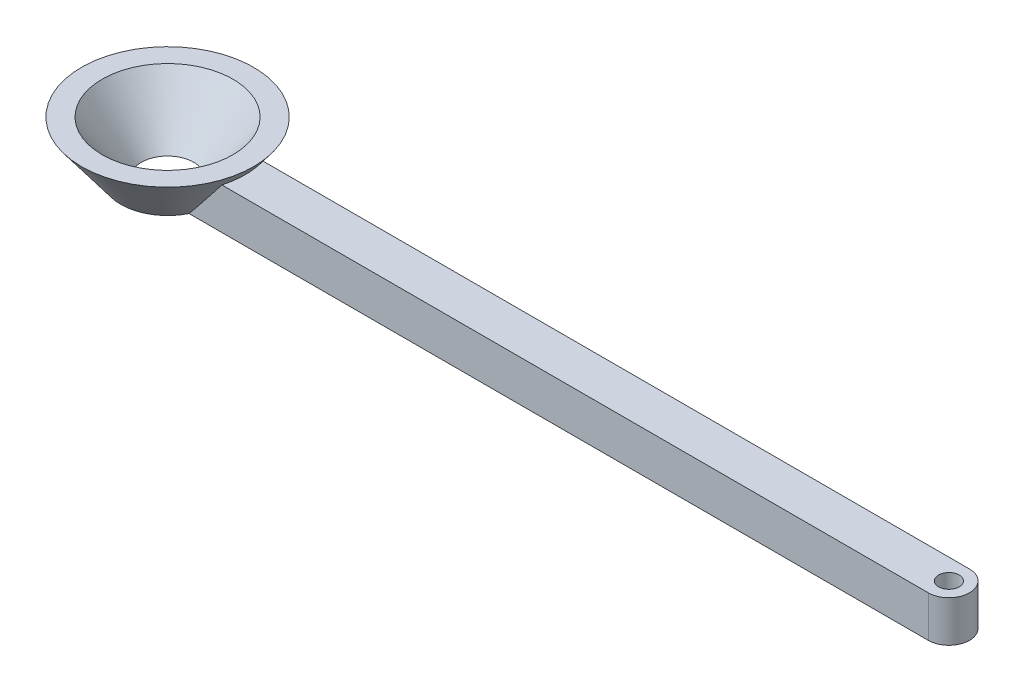
ISO-10303-21;
HEADER;
FILE_DESCRIPTION(('STEP AP214'),'2;1');
FILE_NAME('part.step','',(''),(''),'','','');
FILE_SCHEMA(('AUTOMOTIVE_DESIGN { 1 0 10303 214 1 1 1 1 }'));
ENDSEC;
DATA;
#1=APPLICATION_CONTEXT('core data for automotive mechanical design processes');
#2=APPLICATION_PROTOCOL_DEFINITION('international standard','automotive_design',2000,#1);
#3=PRODUCT_CONTEXT('',#1,'mechanical');
#4=PRODUCT('Part','Part','',(#3));
#5=PRODUCT_RELATED_PRODUCT_CATEGORY('part','',(#4));
#6=PRODUCT_DEFINITION_FORMATION('','',#4);
#7=PRODUCT_DEFINITION_CONTEXT('part definition',#1,'design');
#8=PRODUCT_DEFINITION('design','',#6,#7);
#9=PRODUCT_DEFINITION_SHAPE('','',#8);
#10=(LENGTH_UNIT() NAMED_UNIT(*) SI_UNIT(.MILLI.,.METRE.));
#11=(NAMED_UNIT(*) PLANE_ANGLE_UNIT() SI_UNIT($,.RADIAN.));
#12=(NAMED_UNIT(*) SI_UNIT($,.STERADIAN.) SOLID_ANGLE_UNIT());
#13=UNCERTAINTY_MEASURE_WITH_UNIT(LENGTH_MEASURE(1.E-05),#10,'distance_accuracy_value','');
#14=(GEOMETRIC_REPRESENTATION_CONTEXT(3) GLOBAL_UNCERTAINTY_ASSIGNED_CONTEXT((#13)) GLOBAL_UNIT_ASSIGNED_CONTEXT((#10,
#11,#12)) REPRESENTATION_CONTEXT('',''));
#15=CARTESIAN_POINT('',(0.,0.,0.));
#16=DIRECTION('',(0.,0.,1.));
#17=DIRECTION('',(1.,0.,0.));
#18=AXIS2_PLACEMENT_3D('',#15,#16,#17);
#19=CARTESIAN_POINT('',(0.,10.,-5.));
#20=DIRECTION('',(0.,0.,1.));
#21=DIRECTION('',(1.,0.,0.));
#22=AXIS2_PLACEMENT_3D('',#19,#20,#21);
#23=PLANE('',#22);
#24=CARTESIAN_POINT('',(-62.0302873694782,35.3021651924808,-4.99999999999999));
#25=CARTESIAN_POINT('',(-63.1108720704721,33.8740806067122,-4.99999999999999));
#26=CARTESIAN_POINT('',(-64.1919277877077,32.446351819369,-4.99999999999999));
#27=CARTESIAN_POINT('',(-66.3554224879902,29.591915959772,-4.99999999999999));
#28=CARTESIAN_POINT('',(-67.4378614873972,28.1652088999196,-4.99999999999999));
#29=CARTESIAN_POINT('',(-69.6049899793198,25.3125660458291,-4.99999999999999));
#30=CARTESIAN_POINT('',(-70.689680222095,23.8866308213389,-4.99999999999999));
#31=CARTESIAN_POINT('',(-72.861557258893,21.0366857826083,-4.99999999999999));
#32=CARTESIAN_POINT('',(-73.9487440270011,19.6126759486236,-4.99999999999999));
#33=CARTESIAN_POINT('',(-76.1366785324103,16.7543803279052,-4.99999999999999));
#34=CARTESIAN_POINT('',(-77.2374593053861,15.3201198006345,-4.99999999999999));
#35=CARTESIAN_POINT('',(-78.8928677056523,13.171956183486,-4.99999999999999));
#36=CARTESIAN_POINT('',(-79.445385824924,12.4564277774987,-4.99999999999999));
#37=CARTESIAN_POINT('',(-80.5522230214364,11.0267666172281,-4.99999999999999));
#38=CARTESIAN_POINT('',(-81.1065420956054,10.3126338605673,-4.99999999999999));
#39=CARTESIAN_POINT('',(-82.2173923671904,8.88631956553523,-4.99999999999999));
#40=CARTESIAN_POINT('',(-82.7739230990276,8.17413766481403,-4.99999999999999));
#41=CARTESIAN_POINT('',(-83.8900630153775,6.75219208553308,-4.99999999999999));
#42=CARTESIAN_POINT('',(-84.4496721913153,6.04242840024649,-4.99999999999999));
#43=CARTESIAN_POINT('',(-85.5730514151877,4.6262528714617,-4.99999999999999));
#44=CARTESIAN_POINT('',(-86.1368212512335,3.91984086024302,-4.99999999999999));
#45=CARTESIAN_POINT('',(-86.9869405383949,2.86382443243642,-4.99999999999999));
#46=CARTESIAN_POINT('',(-87.2710558168831,2.51242154847554,-4.99999999999999));
#47=CARTESIAN_POINT('',(-87.8411015414336,1.81109177444719,-4.99999999999999));
#48=CARTESIAN_POINT('',(-88.1270319801504,1.46116487841622,-4.99999999999999));
#49=CARTESIAN_POINT('',(-88.5535217116424,0.942601726981684,-4.99999999999999));
#50=CARTESIAN_POINT('',(-88.6932310449964,0.773266259529523,-4.99999999999999));
#51=CARTESIAN_POINT('',(-88.9732357404597,0.435079886058965,-4.99999999999999));
#52=CARTESIAN_POINT('',(-89.1135311040736,0.266228981286462,-4.99999999999999));
#53=CARTESIAN_POINT('',(-89.5353931244185,-0.239513529313089,-4.99999999999999));
#54=CARTESIAN_POINT('',(-89.8179347024525,-0.575593703650734,-4.99999999999999));
#55=CARTESIAN_POINT('',(-90.3860583503282,-1.24472649661884,-4.99999999999999));
#56=CARTESIAN_POINT('',(-90.6716378780207,-1.57778127131325,-4.99999999999999));
#57=CARTESIAN_POINT('',(-91.246965552302,-2.24028540178618,-4.99999999999999));
#58=CARTESIAN_POINT('',(-91.5367137215942,-2.56973473791138,-4.99999999999999));
#59=CARTESIAN_POINT('',(-92.0233203069065,-3.11378944782606,-4.99999999999999));
#60=CARTESIAN_POINT('',(-92.2186508731109,-3.32976020983891,-4.99999999999999));
#61=CARTESIAN_POINT('',(-92.6122288415135,-3.75900964179536,-4.99999999999999));
#62=CARTESIAN_POINT('',(-92.8104760801282,-3.97228846148121,-4.99999999999999));
#63=CARTESIAN_POINT('',(-93.2106884583959,-4.39559879938018,-4.99999999999999));
#64=CARTESIAN_POINT('',(-93.4126558816584,-4.6056281668364,-4.99999999999999));
#65=CARTESIAN_POINT('',(-93.7189788389496,-4.9173944350338,-4.99999999999999));
#66=CARTESIAN_POINT('',(-93.8216576777768,-5.02077921190277,-4.99999999999999));
#67=CARTESIAN_POINT('',(-94.0282824296164,-5.22628188208933,-4.99999999999999));
#68=CARTESIAN_POINT('',(-94.1322283900686,-5.32839972768361,-4.99999999999999));
#69=CARTESIAN_POINT('',(-94.2368784387653,-5.42979632446492,-4.99999999999999));
#70=B_SPLINE_CURVE_WITH_KNOTS('',3,(#24,#25,#26,#27,#28,#29,#30,#31,#32,#33,#34,#35,#36,#37,#38,
#39,#40,#41,#42,#43,#44,#45,#46,#47,#48,#49,#50,#51,#52,#53,#54,#55,#56,#57,#58,#59,#60,#61,#62,
#63,#64,#65,#66,#67,#68,#69),.UNSPECIFIED.,.F.,.F.,(4,2,2,2,2,2,2,2,2,2,2,2,2,2,2,2,2,2,2,2,2,2,
4),(0.,5.37250467592529,10.7450734922,16.1198827828554,21.4946365315513,26.9185906436164,
29.6306568166589,32.3427183661502,35.0542364098093,37.7657469045783,40.4771202510318,
41.8327888762761,43.1884520188912,43.8470393215209,44.5056283159787,45.8228110708124,
47.1389669273305,48.4551299546749,49.3287083276684,50.2022378908215,51.0763228208418,
51.5134424925067,51.950578580093),.UNSPECIFIED.);
#71=CARTESIAN_POINT('',(-81.350223522695,10.,-4.99999999999999));
#72=VERTEX_POINT('',#71);
#73=CARTESIAN_POINT('',(-89.3356673427549,0.,-4.99999999999999));
#74=VERTEX_POINT('',#73);
#75=EDGE_CURVE('E97',#72,#74,#70,.T.);
#76=ORIENTED_EDGE('',*,*,#75,.F.);
#77=DIRECTION('',(-1.,0.,0.));
#78=VECTOR('',#77,1.);
#79=CARTESIAN_POINT('',(0.,10.,-5.));
#80=LINE('',#79,#78);
#81=CARTESIAN_POINT('',(90.,10.,-5.00000000000001));
#82=VERTEX_POINT('',#81);
#83=EDGE_CURVE('E99',#82,#72,#80,.T.);
#84=ORIENTED_EDGE('',*,*,#83,.F.);
#85=DIRECTION('',(0.,-1.,0.));
#86=VECTOR('',#85,1.);
#87=CARTESIAN_POINT('',(90.,10.,-5.00000000000001));
#88=LINE('',#87,#86);
#89=CARTESIAN_POINT('',(90.,0.,-5.00000000000001));
#90=VERTEX_POINT('',#89);
#91=EDGE_CURVE('E11',#82,#90,#88,.T.);
#92=ORIENTED_EDGE('',*,*,#91,.T.);
#93=DIRECTION('',(-1.,0.,0.));
#94=VECTOR('',#93,1.);
#95=CARTESIAN_POINT('',(0.,0.,-5.));
#96=LINE('',#95,#94);
#97=EDGE_CURVE('E85',#90,#74,#96,.T.);
#98=ORIENTED_EDGE('',*,*,#97,.T.);
#99=EDGE_LOOP('',(#76,#84,#92,#98));
#100=FACE_BOUND('',#99,.T.);
#101=ADVANCED_FACE('F35',(#100),#23,.F.);
#102=CARTESIAN_POINT('',(0.,10.,5.));
#103=DIRECTION('',(0.,0.,1.));
#104=DIRECTION('',(1.,0.,0.));
#105=AXIS2_PLACEMENT_3D('',#102,#103,#104);
#106=PLANE('',#105);
#107=DIRECTION('',(-1.,0.,0.));
#108=VECTOR('',#107,1.);
#109=CARTESIAN_POINT('',(0.,10.,5.));
#110=LINE('',#109,#108);
#111=CARTESIAN_POINT('',(90.,10.,4.99999999999999));
#112=VERTEX_POINT('',#111);
#113=CARTESIAN_POINT('',(-81.350223522695,10.,5.00000000000001));
#114=VERTEX_POINT('',#113);
#115=EDGE_CURVE('E75',#112,#114,#110,.T.);
#116=ORIENTED_EDGE('',*,*,#115,.T.);
#117=CARTESIAN_POINT('',(-62.0302873694782,35.3021651924808,5.00000000000001));
#118=CARTESIAN_POINT('',(-63.1108720704721,33.8740806067122,5.00000000000001));
#119=CARTESIAN_POINT('',(-64.1919277877077,32.446351819369,5.00000000000001));
#120=CARTESIAN_POINT('',(-66.3554224879902,29.591915959772,5.00000000000001));
#121=CARTESIAN_POINT('',(-67.4378614873972,28.1652088999196,5.00000000000001));
#122=CARTESIAN_POINT('',(-69.6049899793198,25.3125660458291,5.00000000000001));
#123=CARTESIAN_POINT('',(-70.689680222095,23.8866308213389,5.00000000000001));
#124=CARTESIAN_POINT('',(-72.861557258893,21.0366857826083,5.00000000000001));
#125=CARTESIAN_POINT('',(-73.9487440270011,19.6126759486236,5.00000000000001));
#126=CARTESIAN_POINT('',(-76.1366785324103,16.7543803279052,5.00000000000001));
#127=CARTESIAN_POINT('',(-77.2374593053861,15.3201198006345,5.00000000000001));
#128=CARTESIAN_POINT('',(-78.8928677056523,13.171956183486,5.00000000000001));
#129=CARTESIAN_POINT('',(-79.445385824924,12.4564277774988,5.00000000000001));
#130=CARTESIAN_POINT('',(-80.5522230214364,11.0267666172281,5.00000000000001));
#131=CARTESIAN_POINT('',(-81.1065420956054,10.3126338605673,5.00000000000001));
#132=CARTESIAN_POINT('',(-82.2173923671904,8.88631956553523,5.00000000000001));
#133=CARTESIAN_POINT('',(-82.7739230990276,8.17413766481403,5.00000000000001));
#134=CARTESIAN_POINT('',(-83.8900630153774,6.75219208553309,5.00000000000001));
#135=CARTESIAN_POINT('',(-84.4496721913153,6.04242840024651,5.00000000000001));
#136=CARTESIAN_POINT('',(-85.5730514151877,4.62625287146172,5.00000000000001));
#137=CARTESIAN_POINT('',(-86.1368212512335,3.91984086024303,5.00000000000001));
#138=CARTESIAN_POINT('',(-86.9869405383949,2.86382443243643,5.00000000000001));
#139=CARTESIAN_POINT('',(-87.271055816883,2.51242154847555,5.00000000000001));
#140=CARTESIAN_POINT('',(-87.8411015414335,1.81109177444721,5.00000000000001));
#141=CARTESIAN_POINT('',(-88.1270319801503,1.46116487841624,5.00000000000001));
#142=CARTESIAN_POINT('',(-88.5535217116424,0.942601726981712,5.00000000000001));
#143=CARTESIAN_POINT('',(-88.6932310449964,0.773266259529552,5.00000000000001));
#144=CARTESIAN_POINT('',(-88.9732357404597,0.435079886058995,5.00000000000001));
#145=CARTESIAN_POINT('',(-89.1135311040736,0.266228981286493,5.00000000000001));
#146=CARTESIAN_POINT('',(-89.5353931244185,-0.239513529313058,5.00000000000001));
#147=CARTESIAN_POINT('',(-89.8179347024525,-0.575593703650703,5.00000000000001));
#148=CARTESIAN_POINT('',(-90.3860583503282,-1.24472649661882,5.00000000000001));
#149=CARTESIAN_POINT('',(-90.6716378780207,-1.57778127131323,5.00000000000001));
#150=CARTESIAN_POINT('',(-91.246965552302,-2.24028540178616,5.00000000000001));
#151=CARTESIAN_POINT('',(-91.5367137215942,-2.56973473791135,5.00000000000001));
#152=CARTESIAN_POINT('',(-92.0233203069065,-3.11378944782602,5.00000000000001));
#153=CARTESIAN_POINT('',(-92.2186508731109,-3.32976020983889,5.00000000000001));
#154=CARTESIAN_POINT('',(-92.6122288415135,-3.75900964179533,5.00000000000001));
#155=CARTESIAN_POINT('',(-92.8104760801282,-3.97228846148118,5.00000000000001));
#156=CARTESIAN_POINT('',(-93.2106884583959,-4.39559879938014,5.00000000000001));
#157=CARTESIAN_POINT('',(-93.4126558816584,-4.60562816683638,5.00000000000001));
#158=CARTESIAN_POINT('',(-93.7189788389496,-4.91739443503377,5.00000000000001));
#159=CARTESIAN_POINT('',(-93.8216576777768,-5.02077921190273,5.00000000000001));
#160=CARTESIAN_POINT('',(-94.0282824296164,-5.22628188208929,5.00000000000001));
#161=CARTESIAN_POINT('',(-94.1322283900686,-5.32839972768358,5.00000000000001));
#162=CARTESIAN_POINT('',(-94.2368784387653,-5.42979632446489,5.00000000000001));
#163=B_SPLINE_CURVE_WITH_KNOTS('',3,(#117,#118,#119,#120,#121,#122,#123,#124,#125,#126,#127,
#128,#129,#130,#131,#132,#133,#134,#135,#136,#137,#138,#139,#140,#141,#142,#143,#144,#145,#146,
#147,#148,#149,#150,#151,#152,#153,#154,#155,#156,#157,#158,#159,#160,#161,#162),.UNSPECIFIED.,
.F.,.F.,(4,2,2,2,2,2,2,2,2,2,2,2,2,2,2,2,2,2,2,2,2,2,4),(0.,5.37250467592528,10.7450734922,
16.1198827828554,21.4946365315514,26.9185906436164,29.630656816659,32.3427183661503,
35.0542364098093,37.7657469045783,40.4771202510318,41.8327888762761,43.1884520188912,
43.8470393215209,44.5056283159787,45.8228110708124,47.1389669273305,48.4551299546748,
49.3287083276684,50.2022378908215,51.0763228208418,51.5134424925067,51.950578580093),.UNSPECIFIED.);
#164=CARTESIAN_POINT('',(-89.3356673427549,0.,5.00000000000002));
#165=VERTEX_POINT('',#164);
#166=EDGE_CURVE('E50',#114,#165,#163,.T.);
#167=ORIENTED_EDGE('',*,*,#166,.T.);
#168=DIRECTION('',(-1.,0.,0.));
#169=VECTOR('',#168,1.);
#170=CARTESIAN_POINT('',(0.,0.,5.));
#171=LINE('',#170,#169);
#172=CARTESIAN_POINT('',(90.,0.,4.99999999999999));
#173=VERTEX_POINT('',#172);
#174=EDGE_CURVE('E83',#173,#165,#171,.T.);
#175=ORIENTED_EDGE('',*,*,#174,.F.);
#176=DIRECTION('',(0.,-1.,0.));
#177=VECTOR('',#176,1.);
#178=CARTESIAN_POINT('',(90.,10.,4.99999999999999));
#179=LINE('',#178,#177);
#180=EDGE_CURVE('E43',#112,#173,#179,.T.);
#181=ORIENTED_EDGE('',*,*,#180,.F.);
#182=EDGE_LOOP('',(#116,#167,#175,#181));
#183=FACE_BOUND('',#182,.T.);
#184=ADVANCED_FACE('F88',(#183),#106,.T.);
#185=CARTESIAN_POINT('',(0.,10.,0.));
#186=DIRECTION('',(0.,1.,0.));
#187=DIRECTION('',(0.,0.,1.));
#188=AXIS2_PLACEMENT_3D('',#185,#186,#187);
#189=PLANE('',#188);
#190=CARTESIAN_POINT('',(89.9999999999996,10.,0.));
#191=DIRECTION('',(0.,1.,0.));
#192=DIRECTION('',(0.,0.,1.));
#193=AXIS2_PLACEMENT_3D('',#190,#191,#192);
#194=CIRCLE('',#193,2.50000000000001);
#195=CARTESIAN_POINT('',(89.9999999999996,10.,2.5));
#196=VERTEX_POINT('',#195);
#197=EDGE_CURVE('E89',#196,#196,#194,.T.);
#198=ORIENTED_EDGE('',*,*,#197,.F.);
#199=EDGE_LOOP('',(#198));
#200=FACE_BOUND('',#199,.T.);
#201=ORIENTED_EDGE('',*,*,#83,.T.);
#202=CARTESIAN_POINT('',(-99.525,10.,0.));
#203=DIRECTION('',(0.,1.,0.));
#204=DIRECTION('',(0.,0.,1.));
#205=AXIS2_PLACEMENT_3D('',#202,#203,#204);
#206=CIRCLE('',#205,18.85);
#207=EDGE_CURVE('E143',#72,#114,#206,.F.);
#208=ORIENTED_EDGE('',*,*,#207,.T.);
#209=ORIENTED_EDGE('',*,*,#115,.F.);
#210=CARTESIAN_POINT('',(89.9999999999996,10.,0.));
#211=DIRECTION('',(0.,1.,0.));
#212=DIRECTION('',(0.,0.,1.));
#213=AXIS2_PLACEMENT_3D('',#210,#211,#212);
#214=CIRCLE('',#213,5.);
#215=EDGE_CURVE('E73',#82,#112,#214,.F.);
#216=ORIENTED_EDGE('',*,*,#215,.F.);
#217=EDGE_LOOP('',(#201,#208,#209,#216));
#218=FACE_BOUND('',#217,.T.);
#219=ADVANCED_FACE('F125',(#200,#218),#189,.T.);
#220=CARTESIAN_POINT('',(89.9999999999996,10.,0.));
#221=DIRECTION('',(0.,-1.,0.));
#222=DIRECTION('',(0.,0.,-1.));
#223=AXIS2_PLACEMENT_3D('',#220,#221,#222);
#224=CYLINDRICAL_SURFACE('',#223,5.);
#225=CARTESIAN_POINT('',(89.9999999999996,0.,0.));
#226=DIRECTION('',(0.,1.,0.));
#227=DIRECTION('',(0.,0.,1.));
#228=AXIS2_PLACEMENT_3D('',#225,#226,#227);
#229=CIRCLE('',#228,5.);
#230=EDGE_CURVE('E71',#90,#173,#229,.F.);
#231=ORIENTED_EDGE('',*,*,#230,.F.);
#232=ORIENTED_EDGE('',*,*,#91,.F.);
#233=ORIENTED_EDGE('',*,*,#215,.T.);
#234=ORIENTED_EDGE('',*,*,#180,.T.);
#235=EDGE_LOOP('',(#231,#232,#233,#234));
#236=FACE_BOUND('',#235,.T.);
#237=ADVANCED_FACE('F70',(#236),#224,.T.);
#238=CARTESIAN_POINT('',(89.9999999999996,10.,0.));
#239=DIRECTION('',(0.,-1.,0.));
#240=DIRECTION('',(0.,0.,-1.));
#241=AXIS2_PLACEMENT_3D('',#238,#239,#240);
#242=CYLINDRICAL_SURFACE('',#241,2.50000000000001);
#243=ORIENTED_EDGE('',*,*,#197,.T.);
#244=EDGE_LOOP('',(#243));
#245=FACE_BOUND('',#244,.T.);
#246=CARTESIAN_POINT('',(89.9999999999996,0.,0.));
#247=DIRECTION('',(0.,1.,0.));
#248=DIRECTION('',(0.,0.,1.));
#249=AXIS2_PLACEMENT_3D('',#246,#247,#248);
#250=CIRCLE('',#249,2.50000000000001);
#251=CARTESIAN_POINT('',(89.9999999999996,0.,2.5));
#252=VERTEX_POINT('',#251);
#253=EDGE_CURVE('E86',#252,#252,#250,.T.);
#254=ORIENTED_EDGE('',*,*,#253,.F.);
#255=EDGE_LOOP('',(#254));
#256=FACE_BOUND('',#255,.T.);
#257=ADVANCED_FACE('F37',(#245,#256),#242,.F.);
#258=CARTESIAN_POINT('',(0.,0.,0.));
#259=DIRECTION('',(0.,1.,0.));
#260=DIRECTION('',(0.,0.,1.));
#261=AXIS2_PLACEMENT_3D('',#258,#259,#260);
#262=PLANE('',#261);
#263=CARTESIAN_POINT('',(-99.525,0.,0.));
#264=DIRECTION('',(0.,1.,0.));
#265=DIRECTION('',(0.,0.,1.));
#266=AXIS2_PLACEMENT_3D('',#263,#264,#265);
#267=CIRCLE('',#266,11.35);
#268=EDGE_CURVE('E144',#74,#165,#267,.T.);
#269=ORIENTED_EDGE('',*,*,#268,.F.);
#270=ORIENTED_EDGE('',*,*,#97,.F.);
#271=ORIENTED_EDGE('',*,*,#230,.T.);
#272=ORIENTED_EDGE('',*,*,#174,.T.);
#273=EDGE_LOOP('',(#269,#270,#271,#272));
#274=FACE_BOUND('',#273,.T.);
#275=ORIENTED_EDGE('',*,*,#253,.T.);
#276=EDGE_LOOP('',(#275));
#277=FACE_BOUND('',#276,.T.);
#278=CARTESIAN_POINT('',(-99.525,0.,0.));
#279=DIRECTION('',(0.,1.,0.));
#280=DIRECTION('',(0.,0.,1.));
#281=AXIS2_PLACEMENT_3D('',#278,#279,#280);
#282=CIRCLE('',#281,6.34999999999999);
#283=CARTESIAN_POINT('',(-99.525,0.,6.34999999999999));
#284=VERTEX_POINT('',#283);
#285=EDGE_CURVE('E153',#284,#284,#282,.T.);
#286=ORIENTED_EDGE('',*,*,#285,.T.);
#287=EDGE_LOOP('',(#286));
#288=FACE_BOUND('',#287,.T.);
#289=ADVANCED_FACE('F80',(#274,#277,#288),#262,.F.);
#290=CARTESIAN_POINT('',(-99.525,12.7,0.));
#291=DIRECTION('',(0.,1.,0.));
#292=DIRECTION('',(0.,0.,1.));
#293=AXIS2_PLACEMENT_3D('',#290,#291,#292);
#294=CONICAL_SURFACE('',#293,15.875,0.643501108793285);
#295=ORIENTED_EDGE('',*,*,#285,.F.);
#296=EDGE_LOOP('',(#295));
#297=FACE_BOUND('',#296,.T.);
#298=CARTESIAN_POINT('',(-99.525,12.7,0.));
#299=DIRECTION('',(0.,1.,0.));
#300=DIRECTION('',(0.,0.,1.));
#301=AXIS2_PLACEMENT_3D('',#298,#299,#300);
#302=CIRCLE('',#301,15.875);
#303=CARTESIAN_POINT('',(-99.525,12.7,15.875));
#304=VERTEX_POINT('',#303);
#305=EDGE_CURVE('E150',#304,#304,#302,.T.);
#306=ORIENTED_EDGE('',*,*,#305,.T.);
#307=EDGE_LOOP('',(#306));
#308=FACE_BOUND('',#307,.T.);
#309=ADVANCED_FACE('F122',(#297,#308),#294,.F.);
#310=CARTESIAN_POINT('',(-99.525,0.,0.));
#311=DIRECTION('',(0.,1.,0.));
#312=DIRECTION('',(0.,0.,1.));
#313=AXIS2_PLACEMENT_3D('',#310,#311,#312);
#314=CONICAL_SURFACE('',#313,11.35,0.643501108793283);
#315=CARTESIAN_POINT('',(-99.525,12.7,0.));
#316=DIRECTION('',(0.,1.,0.));
#317=DIRECTION('',(0.,0.,1.));
#318=AXIS2_PLACEMENT_3D('',#315,#316,#317);
#319=CIRCLE('',#318,20.875);
#320=CARTESIAN_POINT('',(-99.525,12.7,20.875));
#321=VERTEX_POINT('',#320);
#322=EDGE_CURVE('E145',#321,#321,#319,.T.);
#323=ORIENTED_EDGE('',*,*,#322,.F.);
#324=EDGE_LOOP('',(#323));
#325=FACE_BOUND('',#324,.T.);
#326=ORIENTED_EDGE('',*,*,#207,.F.);
#327=ORIENTED_EDGE('',*,*,#75,.T.);
#328=ORIENTED_EDGE('',*,*,#268,.T.);
#329=ORIENTED_EDGE('',*,*,#166,.F.);
#330=EDGE_LOOP('',(#326,#327,#328,#329));
#331=FACE_BOUND('',#330,.T.);
#332=ADVANCED_FACE('F116',(#325,#331),#314,.T.);
#333=CARTESIAN_POINT('',(-78.65,12.7,0.));
#334=DIRECTION('',(0.,-1.,0.));
#335=DIRECTION('',(0.,0.,-1.));
#336=AXIS2_PLACEMENT_3D('',#333,#334,#335);
#337=PLANE('',#336);
#338=ORIENTED_EDGE('',*,*,#305,.F.);
#339=EDGE_LOOP('',(#338));
#340=FACE_BOUND('',#339,.T.);
#341=ORIENTED_EDGE('',*,*,#322,.T.);
#342=EDGE_LOOP('',(#341));
#343=FACE_BOUND('',#342,.T.);
#344=ADVANCED_FACE('F121',(#340,#343),#337,.F.);
#345=CLOSED_SHELL('',(#101,#184,#219,#237,#257,#289,#309,#332,#344));
#346=MANIFOLD_SOLID_BREP('B2',#345);
#347=ADVANCED_BREP_SHAPE_REPRESENTATION('',(#18,#346),#14);
#348=SHAPE_DEFINITION_REPRESENTATION(#9,#347);
ENDSEC;
END-ISO-10303-21;
